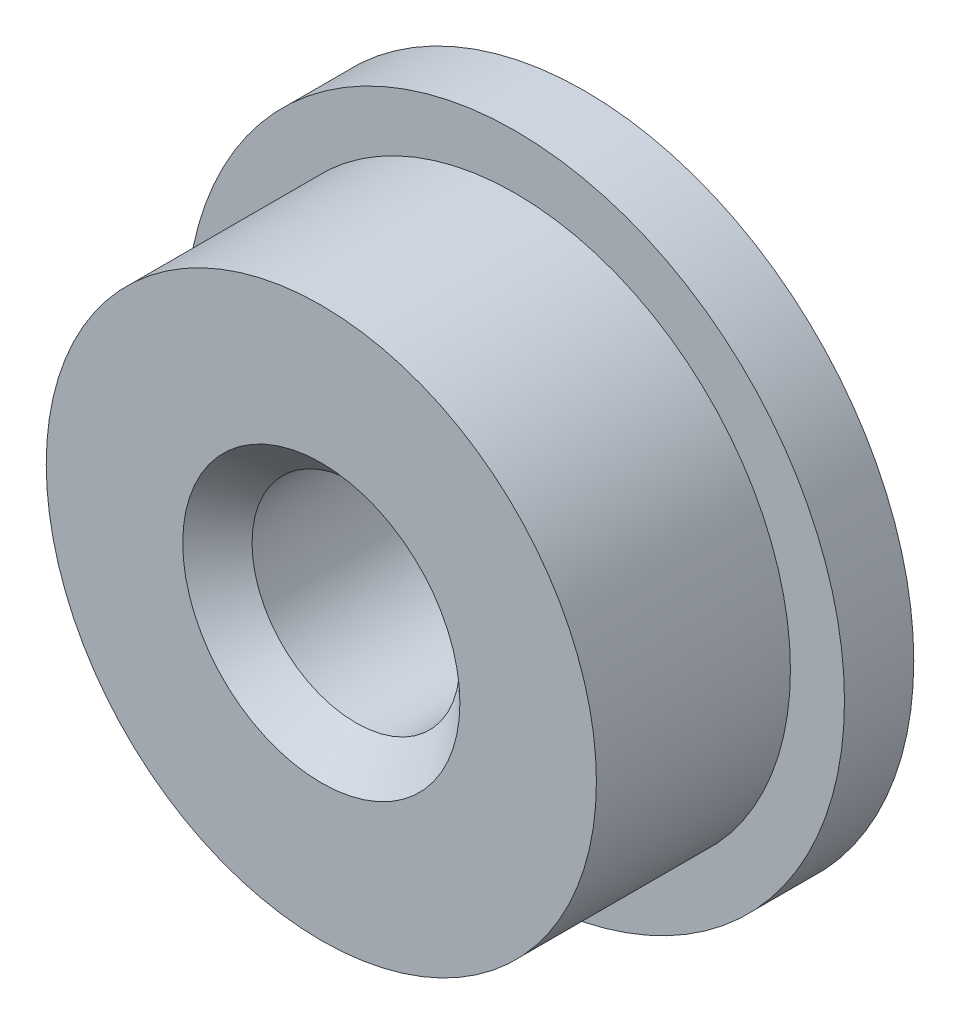
ISO-10303-21;
HEADER;
FILE_DESCRIPTION(('STEP AP214'),'2;1');
FILE_NAME('part.step','',(''),(''),'','','');
FILE_SCHEMA(('AUTOMOTIVE_DESIGN { 1 0 10303 214 1 1 1 1 }'));
ENDSEC;
DATA;
#1=APPLICATION_CONTEXT('core data for automotive mechanical design processes');
#2=APPLICATION_PROTOCOL_DEFINITION('international standard','automotive_design',2000,#1);
#3=PRODUCT_CONTEXT('',#1,'mechanical');
#4=PRODUCT('Part','Part','',(#3));
#5=PRODUCT_RELATED_PRODUCT_CATEGORY('part','',(#4));
#6=PRODUCT_DEFINITION_FORMATION('','',#4);
#7=PRODUCT_DEFINITION_CONTEXT('part definition',#1,'design');
#8=PRODUCT_DEFINITION('design','',#6,#7);
#9=PRODUCT_DEFINITION_SHAPE('','',#8);
#10=(LENGTH_UNIT() NAMED_UNIT(*) SI_UNIT(.MILLI.,.METRE.));
#11=(NAMED_UNIT(*) PLANE_ANGLE_UNIT() SI_UNIT($,.RADIAN.));
#12=(NAMED_UNIT(*) SI_UNIT($,.STERADIAN.) SOLID_ANGLE_UNIT());
#13=UNCERTAINTY_MEASURE_WITH_UNIT(LENGTH_MEASURE(1.E-05),#10,'distance_accuracy_value','');
#14=(GEOMETRIC_REPRESENTATION_CONTEXT(3) GLOBAL_UNCERTAINTY_ASSIGNED_CONTEXT((#13)) GLOBAL_UNIT_ASSIGNED_CONTEXT((#10,
#11,#12)) REPRESENTATION_CONTEXT('',''));
#15=CARTESIAN_POINT('',(0.,0.,0.));
#16=DIRECTION('',(0.,0.,1.));
#17=DIRECTION('',(1.,0.,0.));
#18=AXIS2_PLACEMENT_3D('',#15,#16,#17);
#19=CARTESIAN_POINT('',(0.,0.,0.));
#20=DIRECTION('',(0.,0.,-1.));
#21=DIRECTION('',(-1.,0.,0.));
#22=AXIS2_PLACEMENT_3D('',#19,#20,#21);
#23=CONICAL_SURFACE('',#22,1.99999999989586,0.785398163340605);
#24=CARTESIAN_POINT('',(0.,0.,0.5));
#25=DIRECTION('',(0.,0.,1.));
#26=DIRECTION('',(1.,0.,0.));
#27=AXIS2_PLACEMENT_3D('',#24,#25,#26);
#28=CIRCLE('',#27,1.5);
#29=CARTESIAN_POINT('',(1.5,0.,0.5));
#30=VERTEX_POINT('',#29);
#31=EDGE_CURVE('E47',#30,#30,#28,.T.);
#32=ORIENTED_EDGE('',*,*,#31,.T.);
#33=EDGE_LOOP('',(#32));
#34=FACE_BOUND('',#33,.T.);
#35=CARTESIAN_POINT('',(0.,0.,-5.6843418860808E-11));
#36=DIRECTION('',(0.,0.,-1.));
#37=DIRECTION('',(-1.,0.,0.));
#38=AXIS2_PLACEMENT_3D('',#35,#36,#37);
#39=CIRCLE('',#38,1.99999999995271);
#40=CARTESIAN_POINT('',(-1.99999999995271,0.,-5.6843418860808E-11));
#41=VERTEX_POINT('',#40);
#42=EDGE_CURVE('E18',#41,#41,#39,.T.);
#43=ORIENTED_EDGE('',*,*,#42,.T.);
#44=EDGE_LOOP('',(#43));
#45=FACE_BOUND('',#44,.T.);
#46=ADVANCED_FACE('F15',(#34,#45),#23,.F.);
#47=CARTESIAN_POINT('',(0.,0.,0.));
#48=DIRECTION('',(0.,0.,1.));
#49=DIRECTION('',(1.,0.,0.));
#50=AXIS2_PLACEMENT_3D('',#47,#48,#49);
#51=CYLINDRICAL_SURFACE('',#50,1.5);
#52=ORIENTED_EDGE('',*,*,#31,.F.);
#53=EDGE_LOOP('',(#52));
#54=FACE_BOUND('',#53,.T.);
#55=CARTESIAN_POINT('',(0.,0.,3.30000000002428));
#56=DIRECTION('',(0.,0.,1.));
#57=DIRECTION('',(-1.,0.,0.));
#58=AXIS2_PLACEMENT_3D('',#55,#56,#57);
#59=CIRCLE('',#58,1.49999999990769);
#60=CARTESIAN_POINT('',(-1.49999999990769,0.,3.30000000002428));
#61=VERTEX_POINT('',#60);
#62=EDGE_CURVE('E39',#61,#61,#59,.T.);
#63=ORIENTED_EDGE('',*,*,#62,.T.);
#64=EDGE_LOOP('',(#63));
#65=FACE_BOUND('',#64,.T.);
#66=ADVANCED_FACE('F55',(#54,#65),#51,.F.);
#67=CARTESIAN_POINT('',(0.,0.,0.));
#68=DIRECTION('',(0.,0.,1.));
#69=DIRECTION('',(1.,0.,0.));
#70=AXIS2_PLACEMENT_3D('',#67,#68,#69);
#71=PLANE('',#70);
#72=ORIENTED_EDGE('',*,*,#42,.F.);
#73=EDGE_LOOP('',(#72));
#74=FACE_BOUND('',#73,.T.);
#75=CARTESIAN_POINT('',(0.,0.,0.));
#76=DIRECTION('',(0.,0.,1.));
#77=DIRECTION('',(1.,0.,0.));
#78=AXIS2_PLACEMENT_3D('',#75,#76,#77);
#79=CIRCLE('',#78,4.75);
#80=CARTESIAN_POINT('',(4.75,0.,0.));
#81=VERTEX_POINT('',#80);
#82=EDGE_CURVE('E37',#81,#81,#79,.T.);
#83=ORIENTED_EDGE('',*,*,#82,.F.);
#84=EDGE_LOOP('',(#83));
#85=FACE_BOUND('',#84,.T.);
#86=ADVANCED_FACE('F57',(#74,#85),#71,.F.);
#87=CARTESIAN_POINT('',(0.,0.,3.79999999995562));
#88=DIRECTION('',(0.,0.,1.));
#89=DIRECTION('',(1.,0.,0.));
#90=AXIS2_PLACEMENT_3D('',#87,#88,#89);
#91=CONICAL_SURFACE('',#90,1.99999999983902,0.785398163340605);
#92=CARTESIAN_POINT('',(0.,0.,3.80000000001246));
#93=DIRECTION('',(0.,0.,1.));
#94=DIRECTION('',(1.,0.,0.));
#95=AXIS2_PLACEMENT_3D('',#92,#93,#94);
#96=CIRCLE('',#95,1.99999999989586);
#97=CARTESIAN_POINT('',(1.99999999989586,0.,3.80000000001246));
#98=VERTEX_POINT('',#97);
#99=EDGE_CURVE('E35',#98,#98,#96,.F.);
#100=ORIENTED_EDGE('',*,*,#99,.F.);
#101=EDGE_LOOP('',(#100));
#102=FACE_BOUND('',#101,.T.);
#103=ORIENTED_EDGE('',*,*,#62,.F.);
#104=EDGE_LOOP('',(#103));
#105=FACE_BOUND('',#104,.T.);
#106=ADVANCED_FACE('F63',(#102,#105),#91,.F.);
#107=CARTESIAN_POINT('',(0.,0.,0.));
#108=DIRECTION('',(0.,0.,1.));
#109=DIRECTION('',(1.,0.,0.));
#110=AXIS2_PLACEMENT_3D('',#107,#108,#109);
#111=CYLINDRICAL_SURFACE('',#110,4.75);
#112=ORIENTED_EDGE('',*,*,#82,.T.);
#113=EDGE_LOOP('',(#112));
#114=FACE_BOUND('',#113,.T.);
#115=CARTESIAN_POINT('',(0.,0.,1.));
#116=DIRECTION('',(0.,0.,1.));
#117=DIRECTION('',(1.,0.,0.));
#118=AXIS2_PLACEMENT_3D('',#115,#116,#117);
#119=CIRCLE('',#118,4.75);
#120=CARTESIAN_POINT('',(4.75,0.,1.));
#121=VERTEX_POINT('',#120);
#122=EDGE_CURVE('E27',#121,#121,#119,.T.);
#123=ORIENTED_EDGE('',*,*,#122,.F.);
#124=EDGE_LOOP('',(#123));
#125=FACE_BOUND('',#124,.T.);
#126=ADVANCED_FACE('F80',(#114,#125),#111,.T.);
#127=CARTESIAN_POINT('',(0.,0.,3.8));
#128=DIRECTION('',(0.,0.,1.));
#129=DIRECTION('',(1.,0.,0.));
#130=AXIS2_PLACEMENT_3D('',#127,#128,#129);
#131=PLANE('',#130);
#132=ORIENTED_EDGE('',*,*,#99,.T.);
#133=EDGE_LOOP('',(#132));
#134=FACE_BOUND('',#133,.T.);
#135=CARTESIAN_POINT('',(0.,0.,3.8));
#136=DIRECTION('',(0.,0.,1.));
#137=DIRECTION('',(1.,0.,0.));
#138=AXIS2_PLACEMENT_3D('',#135,#136,#137);
#139=CIRCLE('',#138,3.97);
#140=CARTESIAN_POINT('',(3.97,0.,3.8));
#141=VERTEX_POINT('',#140);
#142=EDGE_CURVE('E22',#141,#141,#139,.F.);
#143=ORIENTED_EDGE('',*,*,#142,.F.);
#144=EDGE_LOOP('',(#143));
#145=FACE_BOUND('',#144,.T.);
#146=ADVANCED_FACE('F73',(#134,#145),#131,.T.);
#147=CARTESIAN_POINT('',(0.,0.,1.));
#148=DIRECTION('',(0.,0.,1.));
#149=DIRECTION('',(1.,0.,0.));
#150=AXIS2_PLACEMENT_3D('',#147,#148,#149);
#151=PLANE('',#150);
#152=CARTESIAN_POINT('',(0.,0.,1.));
#153=DIRECTION('',(0.,0.,1.));
#154=DIRECTION('',(1.,0.,0.));
#155=AXIS2_PLACEMENT_3D('',#152,#153,#154);
#156=CIRCLE('',#155,3.97);
#157=CARTESIAN_POINT('',(3.97,0.,1.));
#158=VERTEX_POINT('',#157);
#159=EDGE_CURVE('E10',#158,#158,#156,.T.);
#160=ORIENTED_EDGE('',*,*,#159,.F.);
#161=EDGE_LOOP('',(#160));
#162=FACE_BOUND('',#161,.T.);
#163=ORIENTED_EDGE('',*,*,#122,.T.);
#164=EDGE_LOOP('',(#163));
#165=FACE_BOUND('',#164,.T.);
#166=ADVANCED_FACE('F68',(#162,#165),#151,.T.);
#167=CARTESIAN_POINT('',(0.,0.,1.));
#168=DIRECTION('',(0.,0.,1.));
#169=DIRECTION('',(1.,0.,0.));
#170=AXIS2_PLACEMENT_3D('',#167,#168,#169);
#171=CYLINDRICAL_SURFACE('',#170,3.97);
#172=ORIENTED_EDGE('',*,*,#159,.T.);
#173=EDGE_LOOP('',(#172));
#174=FACE_BOUND('',#173,.T.);
#175=ORIENTED_EDGE('',*,*,#142,.T.);
#176=EDGE_LOOP('',(#175));
#177=FACE_BOUND('',#176,.T.);
#178=ADVANCED_FACE('F66',(#174,#177),#171,.T.);
#179=CLOSED_SHELL('',(#46,#66,#86,#106,#126,#146,#166,#178));
#180=MANIFOLD_SOLID_BREP('B1',#179);
#181=ADVANCED_BREP_SHAPE_REPRESENTATION('',(#18,#180),#14);
#182=SHAPE_DEFINITION_REPRESENTATION(#9,#181);
ENDSEC;
END-ISO-10303-21;
